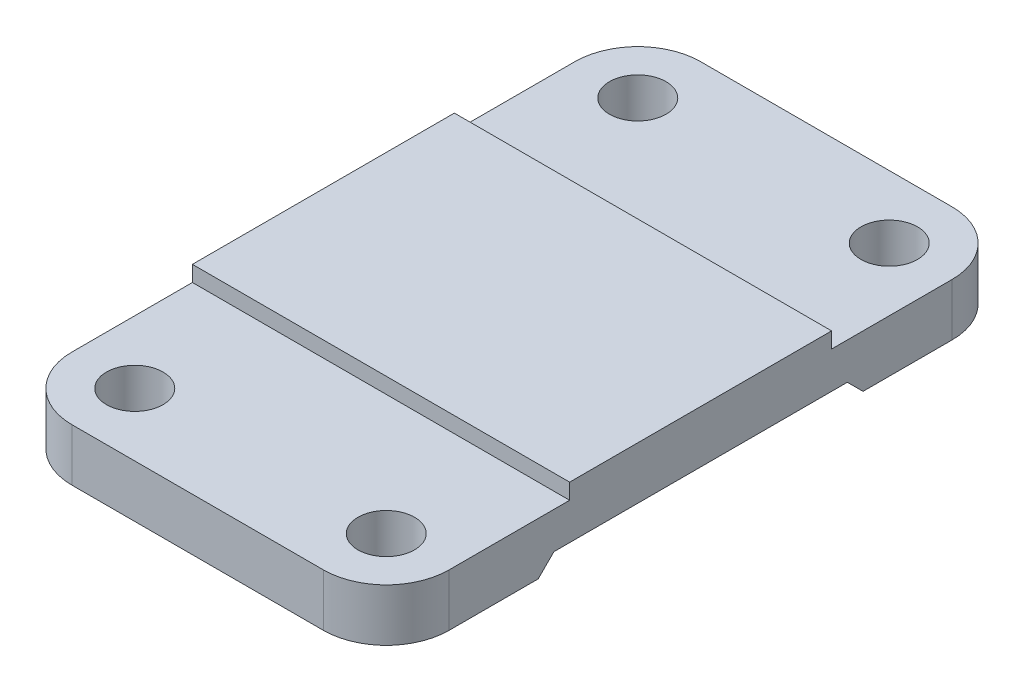
ISO-10303-21;
HEADER;
FILE_DESCRIPTION(('STEP AP214'),'2;1');
FILE_NAME('part.step','',(''),(''),'','','');
FILE_SCHEMA(('AUTOMOTIVE_DESIGN { 1 0 10303 214 1 1 1 1 }'));
ENDSEC;
DATA;
#1=APPLICATION_CONTEXT('core data for automotive mechanical design processes');
#2=APPLICATION_PROTOCOL_DEFINITION('international standard','automotive_design',2000,#1);
#3=PRODUCT_CONTEXT('',#1,'mechanical');
#4=PRODUCT('Part','Part','',(#3));
#5=PRODUCT_RELATED_PRODUCT_CATEGORY('part','',(#4));
#6=PRODUCT_DEFINITION_FORMATION('','',#4);
#7=PRODUCT_DEFINITION_CONTEXT('part definition',#1,'design');
#8=PRODUCT_DEFINITION('design','',#6,#7);
#9=PRODUCT_DEFINITION_SHAPE('','',#8);
#10=(LENGTH_UNIT() NAMED_UNIT(*) SI_UNIT(.MILLI.,.METRE.));
#11=(NAMED_UNIT(*) PLANE_ANGLE_UNIT() SI_UNIT($,.RADIAN.));
#12=(NAMED_UNIT(*) SI_UNIT($,.STERADIAN.) SOLID_ANGLE_UNIT());
#13=UNCERTAINTY_MEASURE_WITH_UNIT(LENGTH_MEASURE(1.E-05),#10,'distance_accuracy_value','');
#14=(GEOMETRIC_REPRESENTATION_CONTEXT(3) GLOBAL_UNCERTAINTY_ASSIGNED_CONTEXT((#13)) GLOBAL_UNIT_ASSIGNED_CONTEXT((#10,
#11,#12)) REPRESENTATION_CONTEXT('',''));
#15=CARTESIAN_POINT('',(0.,0.,0.));
#16=DIRECTION('',(0.,0.,1.));
#17=DIRECTION('',(1.,0.,0.));
#18=AXIS2_PLACEMENT_3D('',#15,#16,#17);
#19=CARTESIAN_POINT('',(36.,9.99999999999999,60.));
#20=DIRECTION('',(0.,-1.,0.));
#21=DIRECTION('',(0.,0.,-1.));
#22=AXIS2_PLACEMENT_3D('',#19,#20,#21);
#23=PLANE('',#22);
#24=DIRECTION('',(0.,0.,1.));
#25=VECTOR('',#24,1.);
#26=CARTESIAN_POINT('',(-36.,9.99999999999999,60.));
#27=LINE('',#26,#25);
#28=CARTESIAN_POINT('',(-36.,9.99999999999999,25.));
#29=VERTEX_POINT('',#28);
#30=CARTESIAN_POINT('',(-36.,9.99999999999999,48.));
#31=VERTEX_POINT('',#30);
#32=EDGE_CURVE('E296',#29,#31,#27,.T.);
#33=ORIENTED_EDGE('',*,*,#32,.T.);
#34=CARTESIAN_POINT('',(-24.,9.99999999999999,48.));
#35=DIRECTION('',(0.,-1.,0.));
#36=DIRECTION('',(0.,0.,-1.));
#37=AXIS2_PLACEMENT_3D('',#34,#35,#36);
#38=CIRCLE('',#37,12.);
#39=CARTESIAN_POINT('',(-24.,9.99999999999999,60.));
#40=VERTEX_POINT('',#39);
#41=EDGE_CURVE('E11',#31,#40,#38,.F.);
#42=ORIENTED_EDGE('',*,*,#41,.T.);
#43=DIRECTION('',(-1.,0.,0.));
#44=VECTOR('',#43,1.);
#45=CARTESIAN_POINT('',(36.,9.99999999999999,60.));
#46=LINE('',#45,#44);
#47=CARTESIAN_POINT('',(24.,9.99999999999999,60.));
#48=VERTEX_POINT('',#47);
#49=EDGE_CURVE('E223',#48,#40,#46,.T.);
#50=ORIENTED_EDGE('',*,*,#49,.F.);
#51=CARTESIAN_POINT('',(24.,9.99999999999999,48.));
#52=DIRECTION('',(0.,-1.,0.));
#53=DIRECTION('',(0.,0.,-1.));
#54=AXIS2_PLACEMENT_3D('',#51,#52,#53);
#55=CIRCLE('',#54,12.);
#56=CARTESIAN_POINT('',(36.,9.99999999999999,48.));
#57=VERTEX_POINT('',#56);
#58=EDGE_CURVE('E51',#48,#57,#55,.F.);
#59=ORIENTED_EDGE('',*,*,#58,.T.);
#60=DIRECTION('',(0.,0.,1.));
#61=VECTOR('',#60,1.);
#62=CARTESIAN_POINT('',(36.,9.99999999999999,60.));
#63=LINE('',#62,#61);
#64=CARTESIAN_POINT('',(36.,9.99999999999999,25.));
#65=VERTEX_POINT('',#64);
#66=EDGE_CURVE('E222',#65,#57,#63,.T.);
#67=ORIENTED_EDGE('',*,*,#66,.F.);
#68=DIRECTION('',(-1.,0.,0.));
#69=VECTOR('',#68,1.);
#70=CARTESIAN_POINT('',(36.,9.99999999999999,25.));
#71=LINE('',#70,#69);
#72=EDGE_CURVE('E241',#65,#29,#71,.T.);
#73=ORIENTED_EDGE('',*,*,#72,.T.);
#74=EDGE_LOOP('',(#33,#42,#50,#59,#67,#73));
#75=FACE_BOUND('',#74,.T.);
#76=CARTESIAN_POINT('',(-24.,10.,48.));
#77=DIRECTION('',(0.,1.,0.));
#78=DIRECTION('',(0.,0.,1.));
#79=AXIS2_PLACEMENT_3D('',#76,#77,#78);
#80=CIRCLE('',#79,5.39999999999999);
#81=CARTESIAN_POINT('',(-24.,10.,53.4));
#82=VERTEX_POINT('',#81);
#83=EDGE_CURVE('E555',#82,#82,#80,.T.);
#84=ORIENTED_EDGE('',*,*,#83,.F.);
#85=EDGE_LOOP('',(#84));
#86=FACE_BOUND('',#85,.T.);
#87=CARTESIAN_POINT('',(24.,10.,48.));
#88=DIRECTION('',(0.,1.,0.));
#89=DIRECTION('',(0.,0.,1.));
#90=AXIS2_PLACEMENT_3D('',#87,#88,#89);
#91=CIRCLE('',#90,5.39999999999999);
#92=CARTESIAN_POINT('',(24.,10.,53.4));
#93=VERTEX_POINT('',#92);
#94=EDGE_CURVE('E552',#93,#93,#91,.T.);
#95=ORIENTED_EDGE('',*,*,#94,.F.);
#96=EDGE_LOOP('',(#95));
#97=FACE_BOUND('',#96,.T.);
#98=ADVANCED_FACE('F43',(#75,#86,#97),#23,.F.);
#99=CARTESIAN_POINT('',(36.,3.00000000000001,28.));
#100=DIRECTION('',(0.,1.,0.));
#101=DIRECTION('',(0.,0.,1.));
#102=AXIS2_PLACEMENT_3D('',#99,#100,#101);
#103=PLANE('',#102);
#104=DIRECTION('',(0.,0.,-1.));
#105=VECTOR('',#104,1.);
#106=CARTESIAN_POINT('',(-36.,3.00000000000001,28.));
#107=LINE('',#106,#105);
#108=CARTESIAN_POINT('',(-36.,3.00000000000001,28.));
#109=VERTEX_POINT('',#108);
#110=CARTESIAN_POINT('',(-36.,3.00000000000001,-28.));
#111=VERTEX_POINT('',#110);
#112=EDGE_CURVE('E181',#109,#111,#107,.T.);
#113=ORIENTED_EDGE('',*,*,#112,.T.);
#114=DIRECTION('',(-1.,0.,0.));
#115=VECTOR('',#114,1.);
#116=CARTESIAN_POINT('',(36.,3.00000000000001,-28.));
#117=LINE('',#116,#115);
#118=CARTESIAN_POINT('',(36.,3.00000000000001,-28.));
#119=VERTEX_POINT('',#118);
#120=EDGE_CURVE('E160',#119,#111,#117,.T.);
#121=ORIENTED_EDGE('',*,*,#120,.F.);
#122=DIRECTION('',(0.,0.,-1.));
#123=VECTOR('',#122,1.);
#124=CARTESIAN_POINT('',(36.,3.00000000000001,28.));
#125=LINE('',#124,#123);
#126=CARTESIAN_POINT('',(36.,3.00000000000001,28.));
#127=VERTEX_POINT('',#126);
#128=EDGE_CURVE('E168',#127,#119,#125,.T.);
#129=ORIENTED_EDGE('',*,*,#128,.F.);
#130=DIRECTION('',(-1.,0.,0.));
#131=VECTOR('',#130,1.);
#132=CARTESIAN_POINT('',(36.,3.00000000000001,28.));
#133=LINE('',#132,#131);
#134=EDGE_CURVE('E244',#127,#109,#133,.T.);
#135=ORIENTED_EDGE('',*,*,#134,.T.);
#136=EDGE_LOOP('',(#113,#121,#129,#135));
#137=FACE_BOUND('',#136,.T.);
#138=ADVANCED_FACE('F179',(#137),#103,.F.);
#139=CARTESIAN_POINT('',(36.,3.00000000000001,-28.));
#140=DIRECTION('',(0.,0.707106781186545,-0.70710678118655));
#141=DIRECTION('',(0.,0.70710678118655,0.707106781186545));
#142=AXIS2_PLACEMENT_3D('',#139,#140,#141);
#143=PLANE('',#142);
#144=DIRECTION('',(0.,-0.70710678118655,-0.707106781186545));
#145=VECTOR('',#144,1.);
#146=CARTESIAN_POINT('',(-36.,3.00000000000001,-28.));
#147=LINE('',#146,#145);
#148=CARTESIAN_POINT('',(-36.,0.,-31.));
#149=VERTEX_POINT('',#148);
#150=EDGE_CURVE('E289',#111,#149,#147,.T.);
#151=ORIENTED_EDGE('',*,*,#150,.T.);
#152=DIRECTION('',(-1.,0.,0.));
#153=VECTOR('',#152,1.);
#154=CARTESIAN_POINT('',(36.,0.,-31.));
#155=LINE('',#154,#153);
#156=CARTESIAN_POINT('',(36.,0.,-31.));
#157=VERTEX_POINT('',#156);
#158=EDGE_CURVE('E163',#157,#149,#155,.T.);
#159=ORIENTED_EDGE('',*,*,#158,.F.);
#160=DIRECTION('',(0.,-0.70710678118655,-0.707106781186545));
#161=VECTOR('',#160,1.);
#162=CARTESIAN_POINT('',(36.,3.00000000000001,-28.));
#163=LINE('',#162,#161);
#164=EDGE_CURVE('E156',#119,#157,#163,.T.);
#165=ORIENTED_EDGE('',*,*,#164,.F.);
#166=ORIENTED_EDGE('',*,*,#120,.T.);
#167=EDGE_LOOP('',(#151,#159,#165,#166));
#168=FACE_BOUND('',#167,.T.);
#169=ADVANCED_FACE('F158',(#168),#143,.F.);
#170=CARTESIAN_POINT('',(36.,0.,-31.));
#171=DIRECTION('',(0.,1.,0.));
#172=DIRECTION('',(0.,0.,1.));
#173=AXIS2_PLACEMENT_3D('',#170,#171,#172);
#174=PLANE('',#173);
#175=CARTESIAN_POINT('',(24.,0.,-48.));
#176=DIRECTION('',(0.,1.,0.));
#177=DIRECTION('',(0.,0.,1.));
#178=AXIS2_PLACEMENT_3D('',#175,#176,#177);
#179=CIRCLE('',#178,5.39999999999999);
#180=CARTESIAN_POINT('',(24.,0.,-42.6));
#181=VERTEX_POINT('',#180);
#182=EDGE_CURVE('E566',#181,#181,#179,.T.);
#183=ORIENTED_EDGE('',*,*,#182,.T.);
#184=EDGE_LOOP('',(#183));
#185=FACE_BOUND('',#184,.T.);
#186=CARTESIAN_POINT('',(-24.,0.,-48.));
#187=DIRECTION('',(0.,1.,0.));
#188=DIRECTION('',(0.,0.,1.));
#189=AXIS2_PLACEMENT_3D('',#186,#187,#188);
#190=CIRCLE('',#189,5.39999999999999);
#191=CARTESIAN_POINT('',(-24.,0.,-42.6));
#192=VERTEX_POINT('',#191);
#193=EDGE_CURVE('E303',#192,#192,#190,.T.);
#194=ORIENTED_EDGE('',*,*,#193,.T.);
#195=EDGE_LOOP('',(#194));
#196=FACE_BOUND('',#195,.T.);
#197=DIRECTION('',(0.,0.,-1.));
#198=VECTOR('',#197,1.);
#199=CARTESIAN_POINT('',(-36.,0.,-31.));
#200=LINE('',#199,#198);
#201=CARTESIAN_POINT('',(-36.,0.,-48.));
#202=VERTEX_POINT('',#201);
#203=EDGE_CURVE('E285',#149,#202,#200,.T.);
#204=ORIENTED_EDGE('',*,*,#203,.T.);
#205=CARTESIAN_POINT('',(-24.,0.,-48.));
#206=DIRECTION('',(0.,1.,0.));
#207=DIRECTION('',(0.,0.,1.));
#208=AXIS2_PLACEMENT_3D('',#205,#206,#207);
#209=CIRCLE('',#208,12.);
#210=CARTESIAN_POINT('',(-24.,0.,-60.));
#211=VERTEX_POINT('',#210);
#212=EDGE_CURVE('E202',#202,#211,#209,.F.);
#213=ORIENTED_EDGE('',*,*,#212,.T.);
#214=DIRECTION('',(-1.,0.,0.));
#215=VECTOR('',#214,1.);
#216=CARTESIAN_POINT('',(36.,0.,-60.));
#217=LINE('',#216,#215);
#218=CARTESIAN_POINT('',(24.,0.,-60.));
#219=VERTEX_POINT('',#218);
#220=EDGE_CURVE('E186',#219,#211,#217,.T.);
#221=ORIENTED_EDGE('',*,*,#220,.F.);
#222=CARTESIAN_POINT('',(24.,0.,-48.));
#223=DIRECTION('',(0.,1.,0.));
#224=DIRECTION('',(0.,0.,1.));
#225=AXIS2_PLACEMENT_3D('',#222,#223,#224);
#226=CIRCLE('',#225,12.);
#227=CARTESIAN_POINT('',(36.,0.,-48.));
#228=VERTEX_POINT('',#227);
#229=EDGE_CURVE('E200',#219,#228,#226,.F.);
#230=ORIENTED_EDGE('',*,*,#229,.T.);
#231=DIRECTION('',(0.,0.,-1.));
#232=VECTOR('',#231,1.);
#233=CARTESIAN_POINT('',(36.,0.,-31.));
#234=LINE('',#233,#232);
#235=EDGE_CURVE('E167',#157,#228,#234,.T.);
#236=ORIENTED_EDGE('',*,*,#235,.F.);
#237=ORIENTED_EDGE('',*,*,#158,.T.);
#238=EDGE_LOOP('',(#204,#213,#221,#230,#236,#237));
#239=FACE_BOUND('',#238,.T.);
#240=ADVANCED_FACE('F304',(#185,#196,#239),#174,.F.);
#241=CARTESIAN_POINT('',(36.,0.,-60.));
#242=DIRECTION('',(0.,0.,1.));
#243=DIRECTION('',(1.,0.,0.));
#244=AXIS2_PLACEMENT_3D('',#241,#242,#243);
#245=PLANE('',#244);
#246=ORIENTED_EDGE('',*,*,#220,.T.);
#247=DIRECTION('',(0.,1.,0.));
#248=VECTOR('',#247,1.);
#249=CARTESIAN_POINT('',(-24.,0.,-60.));
#250=LINE('',#249,#248);
#251=CARTESIAN_POINT('',(-24.,9.99999999999999,-60.));
#252=VERTEX_POINT('',#251);
#253=EDGE_CURVE('E184',#211,#252,#250,.T.);
#254=ORIENTED_EDGE('',*,*,#253,.T.);
#255=DIRECTION('',(-1.,0.,0.));
#256=VECTOR('',#255,1.);
#257=CARTESIAN_POINT('',(36.,9.99999999999999,-60.));
#258=LINE('',#257,#256);
#259=CARTESIAN_POINT('',(24.,9.99999999999999,-60.));
#260=VERTEX_POINT('',#259);
#261=EDGE_CURVE('E258',#260,#252,#258,.T.);
#262=ORIENTED_EDGE('',*,*,#261,.F.);
#263=DIRECTION('',(0.,1.,0.));
#264=VECTOR('',#263,1.);
#265=CARTESIAN_POINT('',(24.,0.,-60.));
#266=LINE('',#265,#264);
#267=EDGE_CURVE('E182',#260,#219,#266,.F.);
#268=ORIENTED_EDGE('',*,*,#267,.T.);
#269=EDGE_LOOP('',(#246,#254,#262,#268));
#270=FACE_BOUND('',#269,.T.);
#271=ADVANCED_FACE('F264',(#270),#245,.F.);
#272=CARTESIAN_POINT('',(36.,9.99999999999999,-60.));
#273=DIRECTION('',(0.,-1.,0.));
#274=DIRECTION('',(0.,0.,-1.));
#275=AXIS2_PLACEMENT_3D('',#272,#273,#274);
#276=PLANE('',#275);
#277=CARTESIAN_POINT('',(24.,10.,-48.));
#278=DIRECTION('',(0.,1.,0.));
#279=DIRECTION('',(0.,0.,1.));
#280=AXIS2_PLACEMENT_3D('',#277,#278,#279);
#281=CIRCLE('',#280,5.39999999999999);
#282=CARTESIAN_POINT('',(24.,10.,-42.6));
#283=VERTEX_POINT('',#282);
#284=EDGE_CURVE('E563',#283,#283,#281,.T.);
#285=ORIENTED_EDGE('',*,*,#284,.F.);
#286=EDGE_LOOP('',(#285));
#287=FACE_BOUND('',#286,.T.);
#288=CARTESIAN_POINT('',(-24.,10.,-48.));
#289=DIRECTION('',(0.,1.,0.));
#290=DIRECTION('',(0.,0.,1.));
#291=AXIS2_PLACEMENT_3D('',#288,#289,#290);
#292=CIRCLE('',#291,5.39999999999999);
#293=CARTESIAN_POINT('',(-24.,10.,-42.6));
#294=VERTEX_POINT('',#293);
#295=EDGE_CURVE('E569',#294,#294,#292,.T.);
#296=ORIENTED_EDGE('',*,*,#295,.F.);
#297=EDGE_LOOP('',(#296));
#298=FACE_BOUND('',#297,.T.);
#299=ORIENTED_EDGE('',*,*,#261,.T.);
#300=CARTESIAN_POINT('',(-24.,9.99999999999999,-48.));
#301=DIRECTION('',(0.,-1.,0.));
#302=DIRECTION('',(0.,0.,-1.));
#303=AXIS2_PLACEMENT_3D('',#300,#301,#302);
#304=CIRCLE('',#303,12.);
#305=CARTESIAN_POINT('',(-36.,9.99999999999999,-48.));
#306=VERTEX_POINT('',#305);
#307=EDGE_CURVE('E194',#252,#306,#304,.F.);
#308=ORIENTED_EDGE('',*,*,#307,.T.);
#309=DIRECTION('',(0.,0.,1.));
#310=VECTOR('',#309,1.);
#311=CARTESIAN_POINT('',(-36.,9.99999999999999,-60.));
#312=LINE('',#311,#310);
#313=CARTESIAN_POINT('',(-36.,9.99999999999999,-25.));
#314=VERTEX_POINT('',#313);
#315=EDGE_CURVE('E277',#306,#314,#312,.T.);
#316=ORIENTED_EDGE('',*,*,#315,.T.);
#317=DIRECTION('',(-1.,0.,0.));
#318=VECTOR('',#317,1.);
#319=CARTESIAN_POINT('',(36.,9.99999999999999,-25.));
#320=LINE('',#319,#318);
#321=CARTESIAN_POINT('',(36.,9.99999999999999,-25.));
#322=VERTEX_POINT('',#321);
#323=EDGE_CURVE('E255',#322,#314,#320,.T.);
#324=ORIENTED_EDGE('',*,*,#323,.F.);
#325=DIRECTION('',(0.,0.,1.));
#326=VECTOR('',#325,1.);
#327=CARTESIAN_POINT('',(36.,9.99999999999999,-60.));
#328=LINE('',#327,#326);
#329=CARTESIAN_POINT('',(36.,9.99999999999999,-48.));
#330=VERTEX_POINT('',#329);
#331=EDGE_CURVE('E306',#330,#322,#328,.T.);
#332=ORIENTED_EDGE('',*,*,#331,.F.);
#333=CARTESIAN_POINT('',(24.,9.99999999999999,-48.));
#334=DIRECTION('',(0.,-1.,0.));
#335=DIRECTION('',(0.,0.,-1.));
#336=AXIS2_PLACEMENT_3D('',#333,#334,#335);
#337=CIRCLE('',#336,12.);
#338=EDGE_CURVE('E192',#330,#260,#337,.F.);
#339=ORIENTED_EDGE('',*,*,#338,.T.);
#340=EDGE_LOOP('',(#299,#308,#316,#324,#332,#339));
#341=FACE_BOUND('',#340,.T.);
#342=ADVANCED_FACE('F275',(#287,#298,#341),#276,.F.);
#343=CARTESIAN_POINT('',(36.,9.99999999999999,-25.));
#344=DIRECTION('',(0.,0.,1.));
#345=DIRECTION('',(1.,0.,0.));
#346=AXIS2_PLACEMENT_3D('',#343,#344,#345);
#347=PLANE('',#346);
#348=DIRECTION('',(0.,1.,0.));
#349=VECTOR('',#348,1.);
#350=CARTESIAN_POINT('',(-36.,9.99999999999999,-25.));
#351=LINE('',#350,#349);
#352=CARTESIAN_POINT('',(-36.,13.,-25.));
#353=VERTEX_POINT('',#352);
#354=EDGE_CURVE('E284',#314,#353,#351,.T.);
#355=ORIENTED_EDGE('',*,*,#354,.T.);
#356=DIRECTION('',(-1.,0.,0.));
#357=VECTOR('',#356,1.);
#358=CARTESIAN_POINT('',(36.,13.,-25.));
#359=LINE('',#358,#357);
#360=CARTESIAN_POINT('',(36.,13.,-25.));
#361=VERTEX_POINT('',#360);
#362=EDGE_CURVE('E252',#361,#353,#359,.T.);
#363=ORIENTED_EDGE('',*,*,#362,.F.);
#364=DIRECTION('',(0.,1.,0.));
#365=VECTOR('',#364,1.);
#366=CARTESIAN_POINT('',(36.,9.99999999999999,-25.));
#367=LINE('',#366,#365);
#368=EDGE_CURVE('E308',#322,#361,#367,.T.);
#369=ORIENTED_EDGE('',*,*,#368,.F.);
#370=ORIENTED_EDGE('',*,*,#323,.T.);
#371=EDGE_LOOP('',(#355,#363,#369,#370));
#372=FACE_BOUND('',#371,.T.);
#373=ADVANCED_FACE('F355',(#372),#347,.F.);
#374=CARTESIAN_POINT('',(36.,13.,25.));
#375=DIRECTION('',(0.,-1.,0.));
#376=DIRECTION('',(0.,0.,-1.));
#377=AXIS2_PLACEMENT_3D('',#374,#375,#376);
#378=PLANE('',#377);
#379=DIRECTION('',(0.,0.,1.));
#380=VECTOR('',#379,1.);
#381=CARTESIAN_POINT('',(-36.,13.,25.));
#382=LINE('',#381,#380);
#383=CARTESIAN_POINT('',(-36.,13.,25.));
#384=VERTEX_POINT('',#383);
#385=EDGE_CURVE('E287',#353,#384,#382,.T.);
#386=ORIENTED_EDGE('',*,*,#385,.T.);
#387=DIRECTION('',(-1.,0.,0.));
#388=VECTOR('',#387,1.);
#389=CARTESIAN_POINT('',(36.,13.,25.));
#390=LINE('',#389,#388);
#391=CARTESIAN_POINT('',(36.,13.,25.));
#392=VERTEX_POINT('',#391);
#393=EDGE_CURVE('E249',#392,#384,#390,.T.);
#394=ORIENTED_EDGE('',*,*,#393,.F.);
#395=DIRECTION('',(0.,0.,1.));
#396=VECTOR('',#395,1.);
#397=CARTESIAN_POINT('',(36.,13.,25.));
#398=LINE('',#397,#396);
#399=EDGE_CURVE('E312',#361,#392,#398,.T.);
#400=ORIENTED_EDGE('',*,*,#399,.F.);
#401=ORIENTED_EDGE('',*,*,#362,.T.);
#402=EDGE_LOOP('',(#386,#394,#400,#401));
#403=FACE_BOUND('',#402,.T.);
#404=ADVANCED_FACE('F319',(#403),#378,.F.);
#405=CARTESIAN_POINT('',(36.,9.99999999999999,25.));
#406=DIRECTION('',(0.,0.,-1.));
#407=DIRECTION('',(-1.,0.,0.));
#408=AXIS2_PLACEMENT_3D('',#405,#406,#407);
#409=PLANE('',#408);
#410=DIRECTION('',(0.,-1.,0.));
#411=VECTOR('',#410,1.);
#412=CARTESIAN_POINT('',(-36.,9.99999999999999,25.));
#413=LINE('',#412,#411);
#414=EDGE_CURVE('E294',#384,#29,#413,.T.);
#415=ORIENTED_EDGE('',*,*,#414,.T.);
#416=ORIENTED_EDGE('',*,*,#72,.F.);
#417=DIRECTION('',(0.,-1.,0.));
#418=VECTOR('',#417,1.);
#419=CARTESIAN_POINT('',(36.,9.99999999999999,25.));
#420=LINE('',#419,#418);
#421=EDGE_CURVE('E228',#392,#65,#420,.T.);
#422=ORIENTED_EDGE('',*,*,#421,.F.);
#423=ORIENTED_EDGE('',*,*,#393,.T.);
#424=EDGE_LOOP('',(#415,#416,#422,#423));
#425=FACE_BOUND('',#424,.T.);
#426=ADVANCED_FACE('F322',(#425),#409,.F.);
#427=CARTESIAN_POINT('',(36.,0.,60.));
#428=DIRECTION('',(0.,0.,-1.));
#429=DIRECTION('',(-1.,0.,0.));
#430=AXIS2_PLACEMENT_3D('',#427,#428,#429);
#431=PLANE('',#430);
#432=ORIENTED_EDGE('',*,*,#49,.T.);
#433=DIRECTION('',(0.,-1.,0.));
#434=VECTOR('',#433,1.);
#435=CARTESIAN_POINT('',(-24.,0.,60.));
#436=LINE('',#435,#434);
#437=CARTESIAN_POINT('',(-24.,0.,60.));
#438=VERTEX_POINT('',#437);
#439=EDGE_CURVE('E211',#40,#438,#436,.T.);
#440=ORIENTED_EDGE('',*,*,#439,.T.);
#441=DIRECTION('',(-1.,0.,0.));
#442=VECTOR('',#441,1.);
#443=CARTESIAN_POINT('',(36.,0.,60.));
#444=LINE('',#443,#442);
#445=CARTESIAN_POINT('',(24.,0.,60.));
#446=VERTEX_POINT('',#445);
#447=EDGE_CURVE('E235',#446,#438,#444,.T.);
#448=ORIENTED_EDGE('',*,*,#447,.F.);
#449=DIRECTION('',(0.,-1.,0.));
#450=VECTOR('',#449,1.);
#451=CARTESIAN_POINT('',(24.,9.99999999999999,60.));
#452=LINE('',#451,#450);
#453=EDGE_CURVE('E63',#446,#48,#452,.F.);
#454=ORIENTED_EDGE('',*,*,#453,.T.);
#455=EDGE_LOOP('',(#432,#440,#448,#454));
#456=FACE_BOUND('',#455,.T.);
#457=ADVANCED_FACE('F237',(#456),#431,.F.);
#458=CARTESIAN_POINT('',(36.,0.,31.));
#459=DIRECTION('',(0.,1.,0.));
#460=DIRECTION('',(0.,0.,1.));
#461=AXIS2_PLACEMENT_3D('',#458,#459,#460);
#462=PLANE('',#461);
#463=CARTESIAN_POINT('',(24.,0.,48.));
#464=DIRECTION('',(0.,1.,0.));
#465=DIRECTION('',(0.,0.,1.));
#466=AXIS2_PLACEMENT_3D('',#463,#464,#465);
#467=CIRCLE('',#466,5.39999999999999);
#468=CARTESIAN_POINT('',(24.,0.,53.4));
#469=VERTEX_POINT('',#468);
#470=EDGE_CURVE('E549',#469,#469,#467,.T.);
#471=ORIENTED_EDGE('',*,*,#470,.T.);
#472=EDGE_LOOP('',(#471));
#473=FACE_BOUND('',#472,.T.);
#474=CARTESIAN_POINT('',(-24.,0.,48.));
#475=DIRECTION('',(0.,1.,0.));
#476=DIRECTION('',(0.,0.,1.));
#477=AXIS2_PLACEMENT_3D('',#474,#475,#476);
#478=CIRCLE('',#477,5.39999999999999);
#479=CARTESIAN_POINT('',(-24.,0.,53.4));
#480=VERTEX_POINT('',#479);
#481=EDGE_CURVE('E560',#480,#480,#478,.T.);
#482=ORIENTED_EDGE('',*,*,#481,.T.);
#483=EDGE_LOOP('',(#482));
#484=FACE_BOUND('',#483,.T.);
#485=ORIENTED_EDGE('',*,*,#447,.T.);
#486=CARTESIAN_POINT('',(-24.,0.,48.));
#487=DIRECTION('',(0.,1.,0.));
#488=DIRECTION('',(0.,0.,1.));
#489=AXIS2_PLACEMENT_3D('',#486,#487,#488);
#490=CIRCLE('',#489,12.);
#491=CARTESIAN_POINT('',(-36.,0.,48.));
#492=VERTEX_POINT('',#491);
#493=EDGE_CURVE('E216',#438,#492,#490,.F.);
#494=ORIENTED_EDGE('',*,*,#493,.T.);
#495=DIRECTION('',(0.,0.,-1.));
#496=VECTOR('',#495,1.);
#497=CARTESIAN_POINT('',(-36.,0.,31.));
#498=LINE('',#497,#496);
#499=CARTESIAN_POINT('',(-36.,0.,31.));
#500=VERTEX_POINT('',#499);
#501=EDGE_CURVE('E298',#492,#500,#498,.T.);
#502=ORIENTED_EDGE('',*,*,#501,.T.);
#503=DIRECTION('',(-1.,0.,0.));
#504=VECTOR('',#503,1.);
#505=CARTESIAN_POINT('',(36.,0.,31.));
#506=LINE('',#505,#504);
#507=CARTESIAN_POINT('',(36.,0.,31.));
#508=VERTEX_POINT('',#507);
#509=EDGE_CURVE('E239',#508,#500,#506,.T.);
#510=ORIENTED_EDGE('',*,*,#509,.F.);
#511=DIRECTION('',(0.,0.,-1.));
#512=VECTOR('',#511,1.);
#513=CARTESIAN_POINT('',(36.,0.,31.));
#514=LINE('',#513,#512);
#515=CARTESIAN_POINT('',(36.,0.,48.));
#516=VERTEX_POINT('',#515);
#517=EDGE_CURVE('E230',#516,#508,#514,.T.);
#518=ORIENTED_EDGE('',*,*,#517,.F.);
#519=CARTESIAN_POINT('',(24.,0.,48.));
#520=DIRECTION('',(0.,1.,0.));
#521=DIRECTION('',(0.,0.,1.));
#522=AXIS2_PLACEMENT_3D('',#519,#520,#521);
#523=CIRCLE('',#522,12.);
#524=EDGE_CURVE('E214',#516,#446,#523,.F.);
#525=ORIENTED_EDGE('',*,*,#524,.T.);
#526=EDGE_LOOP('',(#485,#494,#502,#510,#518,#525));
#527=FACE_BOUND('',#526,.T.);
#528=ADVANCED_FACE('F234',(#473,#484,#527),#462,.F.);
#529=CARTESIAN_POINT('',(36.,3.00000000000001,28.));
#530=DIRECTION('',(0.,0.707106781186545,0.70710678118655));
#531=DIRECTION('',(0.,-0.70710678118655,0.707106781186545));
#532=AXIS2_PLACEMENT_3D('',#529,#530,#531);
#533=PLANE('',#532);
#534=DIRECTION('',(0.,0.70710678118655,-0.707106781186545));
#535=VECTOR('',#534,1.);
#536=CARTESIAN_POINT('',(-36.,3.00000000000001,28.));
#537=LINE('',#536,#535);
#538=EDGE_CURVE('E177',#500,#109,#537,.T.);
#539=ORIENTED_EDGE('',*,*,#538,.T.);
#540=ORIENTED_EDGE('',*,*,#134,.F.);
#541=DIRECTION('',(0.,0.70710678118655,-0.707106781186545));
#542=VECTOR('',#541,1.);
#543=CARTESIAN_POINT('',(36.,3.00000000000001,28.));
#544=LINE('',#543,#542);
#545=EDGE_CURVE('E173',#508,#127,#544,.T.);
#546=ORIENTED_EDGE('',*,*,#545,.F.);
#547=ORIENTED_EDGE('',*,*,#509,.T.);
#548=EDGE_LOOP('',(#539,#540,#546,#547));
#549=FACE_BOUND('',#548,.T.);
#550=ADVANCED_FACE('F330',(#549),#533,.F.);
#551=CARTESIAN_POINT('',(36.,0.,0.));
#552=DIRECTION('',(1.,0.,0.));
#553=DIRECTION('',(0.,0.,-1.));
#554=AXIS2_PLACEMENT_3D('',#551,#552,#553);
#555=PLANE('',#554);
#556=ORIENTED_EDGE('',*,*,#235,.T.);
#557=DIRECTION('',(0.,1.,0.));
#558=VECTOR('',#557,1.);
#559=CARTESIAN_POINT('',(36.,9.99999999999999,-48.));
#560=LINE('',#559,#558);
#561=EDGE_CURVE('E207',#228,#330,#560,.T.);
#562=ORIENTED_EDGE('',*,*,#561,.T.);
#563=ORIENTED_EDGE('',*,*,#331,.T.);
#564=ORIENTED_EDGE('',*,*,#368,.T.);
#565=ORIENTED_EDGE('',*,*,#399,.T.);
#566=ORIENTED_EDGE('',*,*,#421,.T.);
#567=ORIENTED_EDGE('',*,*,#66,.T.);
#568=DIRECTION('',(0.,-1.,0.));
#569=VECTOR('',#568,1.);
#570=CARTESIAN_POINT('',(36.,0.,48.));
#571=LINE('',#570,#569);
#572=EDGE_CURVE('E204',#57,#516,#571,.T.);
#573=ORIENTED_EDGE('',*,*,#572,.T.);
#574=ORIENTED_EDGE('',*,*,#517,.T.);
#575=ORIENTED_EDGE('',*,*,#545,.T.);
#576=ORIENTED_EDGE('',*,*,#128,.T.);
#577=ORIENTED_EDGE('',*,*,#164,.T.);
#578=EDGE_LOOP('',(#556,#562,#563,#564,#565,#566,#567,#573,#574,#575,#576,#577));
#579=FACE_BOUND('',#578,.T.);
#580=ADVANCED_FACE('F171',(#579),#555,.T.);
#581=CARTESIAN_POINT('',(-36.,0.,0.));
#582=DIRECTION('',(1.,0.,0.));
#583=DIRECTION('',(0.,0.,-1.));
#584=AXIS2_PLACEMENT_3D('',#581,#582,#583);
#585=PLANE('',#584);
#586=ORIENTED_EDGE('',*,*,#315,.F.);
#587=DIRECTION('',(0.,1.,0.));
#588=VECTOR('',#587,1.);
#589=CARTESIAN_POINT('',(-36.,0.,-48.));
#590=LINE('',#589,#588);
#591=EDGE_CURVE('E198',#306,#202,#590,.F.);
#592=ORIENTED_EDGE('',*,*,#591,.T.);
#593=ORIENTED_EDGE('',*,*,#203,.F.);
#594=ORIENTED_EDGE('',*,*,#150,.F.);
#595=ORIENTED_EDGE('',*,*,#112,.F.);
#596=ORIENTED_EDGE('',*,*,#538,.F.);
#597=ORIENTED_EDGE('',*,*,#501,.F.);
#598=DIRECTION('',(0.,-1.,0.));
#599=VECTOR('',#598,1.);
#600=CARTESIAN_POINT('',(-36.,0.,48.));
#601=LINE('',#600,#599);
#602=EDGE_CURVE('E196',#492,#31,#601,.F.);
#603=ORIENTED_EDGE('',*,*,#602,.T.);
#604=ORIENTED_EDGE('',*,*,#32,.F.);
#605=ORIENTED_EDGE('',*,*,#414,.F.);
#606=ORIENTED_EDGE('',*,*,#385,.F.);
#607=ORIENTED_EDGE('',*,*,#354,.F.);
#608=EDGE_LOOP('',(#586,#592,#593,#594,#595,#596,#597,#603,#604,#605,#606,#607));
#609=FACE_BOUND('',#608,.T.);
#610=ADVANCED_FACE('F280',(#609),#585,.F.);
#611=CARTESIAN_POINT('',(-24.,0.,-48.));
#612=DIRECTION('',(0.,1.,0.));
#613=DIRECTION('',(0.,0.,1.));
#614=AXIS2_PLACEMENT_3D('',#611,#612,#613);
#615=CYLINDRICAL_SURFACE('',#614,12.);
#616=ORIENTED_EDGE('',*,*,#212,.F.);
#617=ORIENTED_EDGE('',*,*,#591,.F.);
#618=ORIENTED_EDGE('',*,*,#307,.F.);
#619=ORIENTED_EDGE('',*,*,#253,.F.);
#620=EDGE_LOOP('',(#616,#617,#618,#619));
#621=FACE_BOUND('',#620,.T.);
#622=ADVANCED_FACE('F271',(#621),#615,.T.);
#623=CARTESIAN_POINT('',(24.,0.,-48.));
#624=DIRECTION('',(0.,-1.,0.));
#625=DIRECTION('',(0.,0.,-1.));
#626=AXIS2_PLACEMENT_3D('',#623,#624,#625);
#627=CYLINDRICAL_SURFACE('',#626,12.);
#628=ORIENTED_EDGE('',*,*,#229,.F.);
#629=ORIENTED_EDGE('',*,*,#267,.F.);
#630=ORIENTED_EDGE('',*,*,#338,.F.);
#631=ORIENTED_EDGE('',*,*,#561,.F.);
#632=EDGE_LOOP('',(#628,#629,#630,#631));
#633=FACE_BOUND('',#632,.T.);
#634=ADVANCED_FACE('F370',(#633),#627,.T.);
#635=CARTESIAN_POINT('',(-24.,0.,48.));
#636=DIRECTION('',(0.,-1.,0.));
#637=DIRECTION('',(0.,0.,-1.));
#638=AXIS2_PLACEMENT_3D('',#635,#636,#637);
#639=CYLINDRICAL_SURFACE('',#638,12.);
#640=ORIENTED_EDGE('',*,*,#41,.F.);
#641=ORIENTED_EDGE('',*,*,#602,.F.);
#642=ORIENTED_EDGE('',*,*,#493,.F.);
#643=ORIENTED_EDGE('',*,*,#439,.F.);
#644=EDGE_LOOP('',(#640,#641,#642,#643));
#645=FACE_BOUND('',#644,.T.);
#646=ADVANCED_FACE('F328',(#645),#639,.T.);
#647=CARTESIAN_POINT('',(24.,0.,48.));
#648=DIRECTION('',(0.,1.,0.));
#649=DIRECTION('',(0.,0.,1.));
#650=AXIS2_PLACEMENT_3D('',#647,#648,#649);
#651=CYLINDRICAL_SURFACE('',#650,12.);
#652=ORIENTED_EDGE('',*,*,#58,.F.);
#653=ORIENTED_EDGE('',*,*,#453,.F.);
#654=ORIENTED_EDGE('',*,*,#524,.F.);
#655=ORIENTED_EDGE('',*,*,#572,.F.);
#656=EDGE_LOOP('',(#652,#653,#654,#655));
#657=FACE_BOUND('',#656,.T.);
#658=ADVANCED_FACE('F45',(#657),#651,.T.);
#659=CARTESIAN_POINT('',(-24.,9.99999999999999,-48.));
#660=DIRECTION('',(0.,1.,0.));
#661=DIRECTION('',(0.,0.,1.));
#662=AXIS2_PLACEMENT_3D('',#659,#660,#661);
#663=CYLINDRICAL_SURFACE('',#662,5.39999999999999);
#664=ORIENTED_EDGE('',*,*,#193,.F.);
#665=EDGE_LOOP('',(#664));
#666=FACE_BOUND('',#665,.T.);
#667=ORIENTED_EDGE('',*,*,#295,.T.);
#668=EDGE_LOOP('',(#667));
#669=FACE_BOUND('',#668,.T.);
#670=ADVANCED_FACE('F377',(#666,#669),#663,.F.);
#671=CARTESIAN_POINT('',(24.,9.99999999999999,-48.));
#672=DIRECTION('',(0.,1.,0.));
#673=DIRECTION('',(0.,0.,1.));
#674=AXIS2_PLACEMENT_3D('',#671,#672,#673);
#675=CYLINDRICAL_SURFACE('',#674,5.39999999999999);
#676=ORIENTED_EDGE('',*,*,#182,.F.);
#677=EDGE_LOOP('',(#676));
#678=FACE_BOUND('',#677,.T.);
#679=ORIENTED_EDGE('',*,*,#284,.T.);
#680=EDGE_LOOP('',(#679));
#681=FACE_BOUND('',#680,.T.);
#682=ADVANCED_FACE('F382',(#678,#681),#675,.F.);
#683=CARTESIAN_POINT('',(-24.,9.99999999999999,48.));
#684=DIRECTION('',(0.,1.,0.));
#685=DIRECTION('',(0.,0.,1.));
#686=AXIS2_PLACEMENT_3D('',#683,#684,#685);
#687=CYLINDRICAL_SURFACE('',#686,5.39999999999999);
#688=ORIENTED_EDGE('',*,*,#481,.F.);
#689=EDGE_LOOP('',(#688));
#690=FACE_BOUND('',#689,.T.);
#691=ORIENTED_EDGE('',*,*,#83,.T.);
#692=EDGE_LOOP('',(#691));
#693=FACE_BOUND('',#692,.T.);
#694=ADVANCED_FACE('F388',(#690,#693),#687,.F.);
#695=CARTESIAN_POINT('',(24.,9.99999999999999,48.));
#696=DIRECTION('',(0.,1.,0.));
#697=DIRECTION('',(0.,0.,1.));
#698=AXIS2_PLACEMENT_3D('',#695,#696,#697);
#699=CYLINDRICAL_SURFACE('',#698,5.39999999999999);
#700=ORIENTED_EDGE('',*,*,#470,.F.);
#701=EDGE_LOOP('',(#700));
#702=FACE_BOUND('',#701,.T.);
#703=ORIENTED_EDGE('',*,*,#94,.T.);
#704=EDGE_LOOP('',(#703));
#705=FACE_BOUND('',#704,.T.);
#706=ADVANCED_FACE('F450',(#702,#705),#699,.F.);
#707=CLOSED_SHELL('',(#98,#138,#169,#240,#271,#342,#373,#404,#426,#457,#528,#550,#580,#610,#622,
#634,#646,#658,#670,#682,#694,#706));
#708=MANIFOLD_SOLID_BREP('B2',#707);
#709=ADVANCED_BREP_SHAPE_REPRESENTATION('',(#18,#708),#14);
#710=SHAPE_DEFINITION_REPRESENTATION(#9,#709);
ENDSEC;
END-ISO-10303-21;
